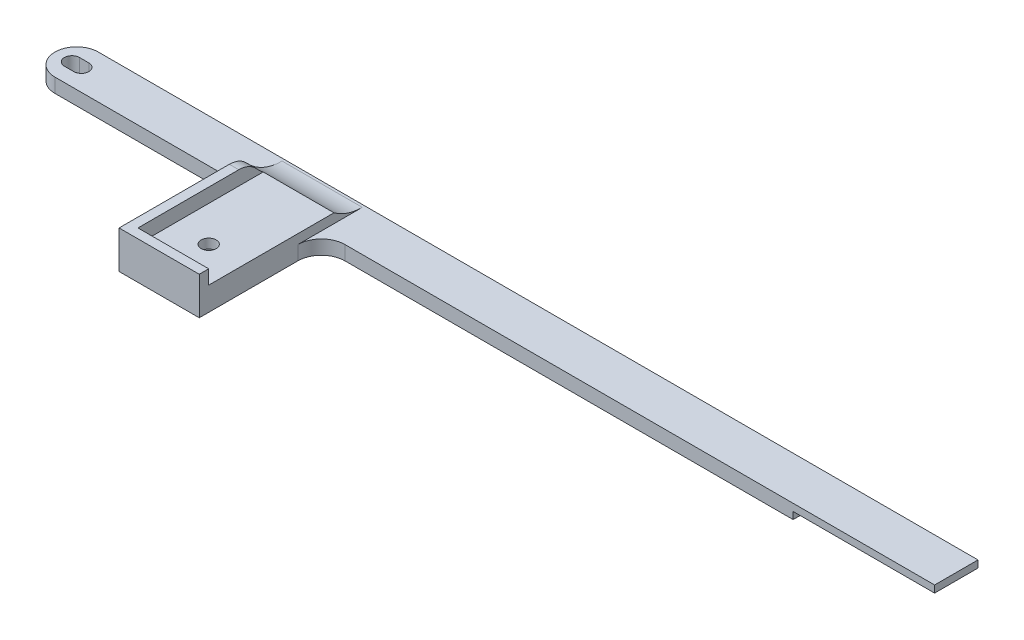
ISO-10303-21;
HEADER;
FILE_DESCRIPTION(('STEP AP214'),'2;1');
FILE_NAME('part.step','',(''),(''),'','','');
FILE_SCHEMA(('AUTOMOTIVE_DESIGN { 1 0 10303 214 1 1 1 1 }'));
ENDSEC;
DATA;
#1=APPLICATION_CONTEXT('core data for automotive mechanical design processes');
#2=APPLICATION_PROTOCOL_DEFINITION('international standard','automotive_design',2000,#1);
#3=PRODUCT_CONTEXT('',#1,'mechanical');
#4=PRODUCT('Part','Part','',(#3));
#5=PRODUCT_RELATED_PRODUCT_CATEGORY('part','',(#4));
#6=PRODUCT_DEFINITION_FORMATION('','',#4);
#7=PRODUCT_DEFINITION_CONTEXT('part definition',#1,'design');
#8=PRODUCT_DEFINITION('design','',#6,#7);
#9=PRODUCT_DEFINITION_SHAPE('','',#8);
#10=(LENGTH_UNIT() NAMED_UNIT(*) SI_UNIT(.MILLI.,.METRE.));
#11=(NAMED_UNIT(*) PLANE_ANGLE_UNIT() SI_UNIT($,.RADIAN.));
#12=(NAMED_UNIT(*) SI_UNIT($,.STERADIAN.) SOLID_ANGLE_UNIT());
#13=UNCERTAINTY_MEASURE_WITH_UNIT(LENGTH_MEASURE(1.E-05),#10,'distance_accuracy_value','');
#14=(GEOMETRIC_REPRESENTATION_CONTEXT(3) GLOBAL_UNCERTAINTY_ASSIGNED_CONTEXT((#13)) GLOBAL_UNIT_ASSIGNED_CONTEXT((#10,
#11,#12)) REPRESENTATION_CONTEXT('',''));
#15=CARTESIAN_POINT('',(0.,0.,0.));
#16=DIRECTION('',(0.,0.,1.));
#17=DIRECTION('',(1.,0.,0.));
#18=AXIS2_PLACEMENT_3D('',#15,#16,#17);
#19=CARTESIAN_POINT('',(30.,1.5,4.6));
#20=DIRECTION('',(0.,1.,0.));
#21=DIRECTION('',(0.,0.,1.));
#22=AXIS2_PLACEMENT_3D('',#19,#20,#21);
#23=PLANE('',#22);
#24=DIRECTION('',(0.,0.,-1.));
#25=VECTOR('',#24,1.);
#26=CARTESIAN_POINT('',(0.,1.5,4.6));
#27=LINE('',#26,#25);
#28=CARTESIAN_POINT('',(0.,1.5,4.6));
#29=VERTEX_POINT('',#28);
#30=CARTESIAN_POINT('',(0.,1.5,-4.6));
#31=VERTEX_POINT('',#30);
#32=EDGE_CURVE('E265',#29,#31,#27,.T.);
#33=ORIENTED_EDGE('',*,*,#32,.T.);
#34=DIRECTION('',(-1.,0.,0.));
#35=VECTOR('',#34,1.);
#36=CARTESIAN_POINT('',(30.,1.5,-4.6));
#37=LINE('',#36,#35);
#38=CARTESIAN_POINT('',(30.,1.5,-4.6));
#39=VERTEX_POINT('',#38);
#40=EDGE_CURVE('E283',#39,#31,#37,.T.);
#41=ORIENTED_EDGE('',*,*,#40,.F.);
#42=DIRECTION('',(0.,0.,-1.));
#43=VECTOR('',#42,1.);
#44=CARTESIAN_POINT('',(30.,1.5,4.6));
#45=LINE('',#44,#43);
#46=CARTESIAN_POINT('',(30.,1.5,4.6));
#47=VERTEX_POINT('',#46);
#48=EDGE_CURVE('E276',#47,#39,#45,.T.);
#49=ORIENTED_EDGE('',*,*,#48,.F.);
#50=DIRECTION('',(-1.,0.,0.));
#51=VECTOR('',#50,1.);
#52=CARTESIAN_POINT('',(30.,1.5,4.6));
#53=LINE('',#52,#51);
#54=EDGE_CURVE('E287',#47,#29,#53,.T.);
#55=ORIENTED_EDGE('',*,*,#54,.T.);
#56=EDGE_LOOP('',(#33,#41,#49,#55));
#57=FACE_BOUND('',#56,.T.);
#58=DIRECTION('',(0.,0.,-1.));
#59=VECTOR('',#58,1.);
#60=CARTESIAN_POINT('',(10.1,1.5,2.4));
#61=LINE('',#60,#59);
#62=CARTESIAN_POINT('',(10.1,1.5,2.4));
#63=VERTEX_POINT('',#62);
#64=CARTESIAN_POINT('',(10.1,1.5,-2.4));
#65=VERTEX_POINT('',#64);
#66=EDGE_CURVE('E264',#63,#65,#61,.T.);
#67=ORIENTED_EDGE('',*,*,#66,.F.);
#68=DIRECTION('',(-1.,0.,0.));
#69=VECTOR('',#68,1.);
#70=CARTESIAN_POINT('',(19.9,1.5,2.4));
#71=LINE('',#70,#69);
#72=CARTESIAN_POINT('',(19.9,1.5,2.4));
#73=VERTEX_POINT('',#72);
#74=EDGE_CURVE('E261',#73,#63,#71,.T.);
#75=ORIENTED_EDGE('',*,*,#74,.F.);
#76=DIRECTION('',(0.,0.,1.));
#77=VECTOR('',#76,1.);
#78=CARTESIAN_POINT('',(19.9,1.5,2.4));
#79=LINE('',#78,#77);
#80=CARTESIAN_POINT('',(19.9,1.5,-2.4));
#81=VERTEX_POINT('',#80);
#82=EDGE_CURVE('E55',#81,#73,#79,.T.);
#83=ORIENTED_EDGE('',*,*,#82,.F.);
#84=DIRECTION('',(1.,0.,0.));
#85=VECTOR('',#84,1.);
#86=CARTESIAN_POINT('',(19.9,1.5,-2.4));
#87=LINE('',#86,#85);
#88=EDGE_CURVE('E50',#65,#81,#87,.T.);
#89=ORIENTED_EDGE('',*,*,#88,.F.);
#90=EDGE_LOOP('',(#67,#75,#83,#89));
#91=FACE_BOUND('',#90,.T.);
#92=ADVANCED_FACE('F33',(#57,#91),#23,.F.);
#93=CARTESIAN_POINT('',(0.,0.,0.));
#94=DIRECTION('',(1.,0.,0.));
#95=DIRECTION('',(0.,0.,-1.));
#96=AXIS2_PLACEMENT_3D('',#93,#94,#95);
#97=PLANE('',#96);
#98=ORIENTED_EDGE('',*,*,#32,.F.);
#99=DIRECTION('',(0.,-1.,0.));
#100=VECTOR('',#99,1.);
#101=CARTESIAN_POINT('',(0.,3.,4.6));
#102=LINE('',#101,#100);
#103=CARTESIAN_POINT('',(0.,0.,4.6));
#104=VERTEX_POINT('',#103);
#105=EDGE_CURVE('E294',#29,#104,#102,.T.);
#106=ORIENTED_EDGE('',*,*,#105,.T.);
#107=DIRECTION('',(0.,0.,-1.));
#108=VECTOR('',#107,1.);
#109=CARTESIAN_POINT('',(0.,0.,0.));
#110=LINE('',#109,#108);
#111=CARTESIAN_POINT('',(0.,0.,-4.6));
#112=VERTEX_POINT('',#111);
#113=EDGE_CURVE('E476',#104,#112,#110,.T.);
#114=ORIENTED_EDGE('',*,*,#113,.T.);
#115=DIRECTION('',(0.,1.,0.));
#116=VECTOR('',#115,1.);
#117=CARTESIAN_POINT('',(0.,3.,-4.6));
#118=LINE('',#117,#116);
#119=EDGE_CURVE('E290',#112,#31,#118,.T.);
#120=ORIENTED_EDGE('',*,*,#119,.T.);
#121=EDGE_LOOP('',(#98,#106,#114,#120));
#122=FACE_BOUND('',#121,.T.);
#123=ADVANCED_FACE('F502',(#122),#97,.T.);
#124=CARTESIAN_POINT('',(156.5,3.,4.6));
#125=DIRECTION('',(0.,0.,-1.));
#126=DIRECTION('',(-1.,0.,0.));
#127=AXIS2_PLACEMENT_3D('',#124,#125,#126);
#128=PLANE('',#127);
#129=ORIENTED_EDGE('',*,*,#105,.F.);
#130=ORIENTED_EDGE('',*,*,#54,.F.);
#131=DIRECTION('',(0.,-1.,0.));
#132=VECTOR('',#131,1.);
#133=CARTESIAN_POINT('',(30.,3.,4.6));
#134=LINE('',#133,#132);
#135=CARTESIAN_POINT('',(30.,3.,4.6));
#136=VERTEX_POINT('',#135);
#137=EDGE_CURVE('E268',#136,#47,#134,.T.);
#138=ORIENTED_EDGE('',*,*,#137,.F.);
#139=DIRECTION('',(1.,0.,0.));
#140=VECTOR('',#139,1.);
#141=CARTESIAN_POINT('',(156.5,3.,4.6));
#142=LINE('',#141,#140);
#143=CARTESIAN_POINT('',(-94.9999999999999,3.,4.6));
#144=VERTEX_POINT('',#143);
#145=EDGE_CURVE('E356',#144,#136,#142,.T.);
#146=ORIENTED_EDGE('',*,*,#145,.F.);
#147=DIRECTION('',(0.,-1.,0.));
#148=VECTOR('',#147,1.);
#149=CARTESIAN_POINT('',(-94.9999999999999,0.,4.6));
#150=LINE('',#149,#148);
#151=CARTESIAN_POINT('',(-94.9999999999999,0.,4.6));
#152=VERTEX_POINT('',#151);
#153=EDGE_CURVE('E318',#144,#152,#150,.T.);
#154=ORIENTED_EDGE('',*,*,#153,.T.);
#155=DIRECTION('',(1.,0.,0.));
#156=VECTOR('',#155,1.);
#157=CARTESIAN_POINT('',(156.5,0.,4.6));
#158=LINE('',#157,#156);
#159=EDGE_CURVE('E351',#152,#104,#158,.T.);
#160=ORIENTED_EDGE('',*,*,#159,.T.);
#161=EDGE_LOOP('',(#129,#130,#138,#146,#154,#160));
#162=FACE_BOUND('',#161,.T.);
#163=ADVANCED_FACE('F494',(#162),#128,.F.);
#164=CARTESIAN_POINT('',(-156.5,3.,0.));
#165=DIRECTION('',(0.,1.,0.));
#166=DIRECTION('',(0.,0.,1.));
#167=AXIS2_PLACEMENT_3D('',#164,#165,#166);
#168=PLANE('',#167);
#169=DIRECTION('',(-1.,0.,0.));
#170=VECTOR('',#169,1.);
#171=CARTESIAN_POINT('',(-155.5,3.,-1.59999999999996));
#172=LINE('',#171,#170);
#173=CARTESIAN_POINT('',(-155.5,3.,-1.59999999999996));
#174=VERTEX_POINT('',#173);
#175=CARTESIAN_POINT('',(-157.5,3.,-1.59999999999996));
#176=VERTEX_POINT('',#175);
#177=EDGE_CURVE('E385',#174,#176,#172,.T.);
#178=ORIENTED_EDGE('',*,*,#177,.F.);
#179=CARTESIAN_POINT('',(-155.5,3.,0.));
#180=DIRECTION('',(0.,1.,0.));
#181=DIRECTION('',(0.,0.,1.));
#182=AXIS2_PLACEMENT_3D('',#179,#180,#181);
#183=CIRCLE('',#182,1.59999999999996);
#184=CARTESIAN_POINT('',(-155.5,3.,1.59999999999996));
#185=VERTEX_POINT('',#184);
#186=EDGE_CURVE('E371',#185,#174,#183,.T.);
#187=ORIENTED_EDGE('',*,*,#186,.F.);
#188=DIRECTION('',(1.,0.,0.));
#189=VECTOR('',#188,1.);
#190=CARTESIAN_POINT('',(-155.5,3.,1.59999999999996));
#191=LINE('',#190,#189);
#192=CARTESIAN_POINT('',(-157.5,3.,1.60000000000004));
#193=VERTEX_POINT('',#192);
#194=EDGE_CURVE('E366',#193,#185,#191,.T.);
#195=ORIENTED_EDGE('',*,*,#194,.F.);
#196=CARTESIAN_POINT('',(-157.5,3.,0.));
#197=DIRECTION('',(0.,1.,0.));
#198=DIRECTION('',(0.,0.,1.));
#199=AXIS2_PLACEMENT_3D('',#196,#197,#198);
#200=CIRCLE('',#199,1.6);
#201=EDGE_CURVE('E382',#176,#193,#200,.T.);
#202=ORIENTED_EDGE('',*,*,#201,.F.);
#203=EDGE_LOOP('',(#178,#187,#195,#202));
#204=FACE_BOUND('',#203,.T.);
#205=ORIENTED_EDGE('',*,*,#145,.T.);
#206=DIRECTION('',(0.,0.,1.));
#207=VECTOR('',#206,1.);
#208=CARTESIAN_POINT('',(30.,3.,4.6));
#209=LINE('',#208,#207);
#210=CARTESIAN_POINT('',(30.,3.,-4.6));
#211=VERTEX_POINT('',#210);
#212=EDGE_CURVE('E281',#211,#136,#209,.T.);
#213=ORIENTED_EDGE('',*,*,#212,.F.);
#214=DIRECTION('',(-1.,0.,0.));
#215=VECTOR('',#214,1.);
#216=CARTESIAN_POINT('',(-156.5,3.,-4.6));
#217=LINE('',#216,#215);
#218=CARTESIAN_POINT('',(-156.5,3.,-4.6));
#219=VERTEX_POINT('',#218);
#220=EDGE_CURVE('E346',#211,#219,#217,.T.);
#221=ORIENTED_EDGE('',*,*,#220,.T.);
#222=CARTESIAN_POINT('',(-156.5,3.,0.));
#223=DIRECTION('',(0.,1.,0.));
#224=DIRECTION('',(0.,0.,1.));
#225=AXIS2_PLACEMENT_3D('',#222,#223,#224);
#226=CIRCLE('',#225,4.6);
#227=CARTESIAN_POINT('',(-156.5,3.,4.6));
#228=VERTEX_POINT('',#227);
#229=EDGE_CURVE('E352',#219,#228,#226,.T.);
#230=ORIENTED_EDGE('',*,*,#229,.T.);
#231=CARTESIAN_POINT('',(-122.,3.,4.6));
#232=VERTEX_POINT('',#231);
#233=EDGE_CURVE('E481',#228,#232,#142,.T.);
#234=ORIENTED_EDGE('',*,*,#233,.T.);
#235=CARTESIAN_POINT('',(-122.,3.,9.6));
#236=DIRECTION('',(0.,1.,0.));
#237=DIRECTION('',(0.,0.,1.));
#238=AXIS2_PLACEMENT_3D('',#235,#236,#237);
#239=CIRCLE('',#238,5.);
#240=CARTESIAN_POINT('',(-117.,3.,9.6));
#241=VERTEX_POINT('',#240);
#242=EDGE_CURVE('E301',#232,#241,#239,.F.);
#243=ORIENTED_EDGE('',*,*,#242,.T.);
#244=DIRECTION('',(0.,0.,-1.));
#245=VECTOR('',#244,1.);
#246=CARTESIAN_POINT('',(-117.,3.,0.));
#247=LINE('',#246,#245);
#248=CARTESIAN_POINT('',(-117.,3.,-4.06025403784438));
#249=VERTEX_POINT('',#248);
#250=EDGE_CURVE('E337',#241,#249,#247,.T.);
#251=ORIENTED_EDGE('',*,*,#250,.T.);
#252=DIRECTION('',(-1.,0.,0.));
#253=VECTOR('',#252,1.);
#254=CARTESIAN_POINT('',(-99.9999999999999,3.,-4.06025403784438));
#255=LINE('',#254,#253);
#256=CARTESIAN_POINT('',(-100.,3.,-4.06025403784438));
#257=VERTEX_POINT('',#256);
#258=EDGE_CURVE('E334',#249,#257,#255,.F.);
#259=ORIENTED_EDGE('',*,*,#258,.T.);
#260=DIRECTION('',(0.,0.,1.));
#261=VECTOR('',#260,1.);
#262=CARTESIAN_POINT('',(-100.,3.,0.));
#263=LINE('',#262,#261);
#264=CARTESIAN_POINT('',(-100.,3.,9.6));
#265=VERTEX_POINT('',#264);
#266=EDGE_CURVE('E332',#257,#265,#263,.T.);
#267=ORIENTED_EDGE('',*,*,#266,.T.);
#268=CARTESIAN_POINT('',(-94.9999999999999,3.,9.6));
#269=DIRECTION('',(0.,1.,0.));
#270=DIRECTION('',(0.,0.,1.));
#271=AXIS2_PLACEMENT_3D('',#268,#269,#270);
#272=CIRCLE('',#271,5.);
#273=EDGE_CURVE('E306',#265,#144,#272,.F.);
#274=ORIENTED_EDGE('',*,*,#273,.T.);
#275=EDGE_LOOP('',(#205,#213,#221,#230,#234,#243,#251,#259,#267,#274));
#276=FACE_BOUND('',#275,.T.);
#277=ADVANCED_FACE('F511',(#204,#276),#168,.T.);
#278=CARTESIAN_POINT('',(-156.5,0.,0.));
#279=DIRECTION('',(0.,1.,0.));
#280=DIRECTION('',(0.,0.,1.));
#281=AXIS2_PLACEMENT_3D('',#278,#279,#280);
#282=PLANE('',#281);
#283=CARTESIAN_POINT('',(-155.5,0.,0.));
#284=DIRECTION('',(0.,1.,0.));
#285=DIRECTION('',(0.,0.,1.));
#286=AXIS2_PLACEMENT_3D('',#283,#284,#285);
#287=CIRCLE('',#286,1.59999999999996);
#288=CARTESIAN_POINT('',(-155.5,0.,1.59999999999996));
#289=VERTEX_POINT('',#288);
#290=CARTESIAN_POINT('',(-155.5,0.,-1.59999999999996));
#291=VERTEX_POINT('',#290);
#292=EDGE_CURVE('E377',#289,#291,#287,.T.);
#293=ORIENTED_EDGE('',*,*,#292,.T.);
#294=DIRECTION('',(-1.,0.,0.));
#295=VECTOR('',#294,1.);
#296=CARTESIAN_POINT('',(-155.5,0.,-1.59999999999996));
#297=LINE('',#296,#295);
#298=CARTESIAN_POINT('',(-157.5,0.,-1.59999999999996));
#299=VERTEX_POINT('',#298);
#300=EDGE_CURVE('E374',#291,#299,#297,.T.);
#301=ORIENTED_EDGE('',*,*,#300,.T.);
#302=CARTESIAN_POINT('',(-157.5,0.,0.));
#303=DIRECTION('',(0.,1.,0.));
#304=DIRECTION('',(0.,0.,1.));
#305=AXIS2_PLACEMENT_3D('',#302,#303,#304);
#306=CIRCLE('',#305,1.6);
#307=CARTESIAN_POINT('',(-157.5,0.,1.60000000000004));
#308=VERTEX_POINT('',#307);
#309=EDGE_CURVE('E370',#299,#308,#306,.T.);
#310=ORIENTED_EDGE('',*,*,#309,.T.);
#311=DIRECTION('',(1.,0.,0.));
#312=VECTOR('',#311,1.);
#313=CARTESIAN_POINT('',(-155.5,0.,1.59999999999996));
#314=LINE('',#313,#312);
#315=EDGE_CURVE('E367',#308,#289,#314,.T.);
#316=ORIENTED_EDGE('',*,*,#315,.T.);
#317=EDGE_LOOP('',(#293,#301,#310,#316));
#318=FACE_BOUND('',#317,.T.);
#319=DIRECTION('',(-0.866025403784438,0.,-0.500000000000001));
#320=VECTOR('',#319,1.);
#321=CARTESIAN_POINT('',(-107.5,0.,24.2331615074619));
#322=LINE('',#321,#320);
#323=CARTESIAN_POINT('',(-107.5,0.,24.2331615074619));
#324=VERTEX_POINT('',#323);
#325=CARTESIAN_POINT('',(-110.3,0.,22.616580753731));
#326=VERTEX_POINT('',#325);
#327=EDGE_CURVE('E452',#324,#326,#322,.T.);
#328=ORIENTED_EDGE('',*,*,#327,.F.);
#329=DIRECTION('',(-0.866025403784439,0.,0.499999999999999));
#330=VECTOR('',#329,1.);
#331=CARTESIAN_POINT('',(-104.7,0.,22.6165807537309));
#332=LINE('',#331,#330);
#333=CARTESIAN_POINT('',(-104.7,0.,22.6165807537309));
#334=VERTEX_POINT('',#333);
#335=EDGE_CURVE('E455',#334,#324,#332,.T.);
#336=ORIENTED_EDGE('',*,*,#335,.F.);
#337=DIRECTION('',(0.,0.,1.));
#338=VECTOR('',#337,1.);
#339=CARTESIAN_POINT('',(-104.7,0.,19.383419246269));
#340=LINE('',#339,#338);
#341=CARTESIAN_POINT('',(-104.7,0.,19.383419246269));
#342=VERTEX_POINT('',#341);
#343=EDGE_CURVE('E439',#342,#334,#340,.T.);
#344=ORIENTED_EDGE('',*,*,#343,.F.);
#345=DIRECTION('',(0.866025403784438,0.,0.500000000000001));
#346=VECTOR('',#345,1.);
#347=CARTESIAN_POINT('',(-107.5,0.,17.7668384925381));
#348=LINE('',#347,#346);
#349=CARTESIAN_POINT('',(-107.5,0.,17.7668384925381));
#350=VERTEX_POINT('',#349);
#351=EDGE_CURVE('E442',#350,#342,#348,.T.);
#352=ORIENTED_EDGE('',*,*,#351,.F.);
#353=DIRECTION('',(0.866025403784439,0.,-0.5));
#354=VECTOR('',#353,1.);
#355=CARTESIAN_POINT('',(-110.3,0.,19.383419246269));
#356=LINE('',#355,#354);
#357=CARTESIAN_POINT('',(-110.3,0.,19.383419246269));
#358=VERTEX_POINT('',#357);
#359=EDGE_CURVE('E446',#358,#350,#356,.T.);
#360=ORIENTED_EDGE('',*,*,#359,.F.);
#361=DIRECTION('',(0.,0.,-1.));
#362=VECTOR('',#361,1.);
#363=CARTESIAN_POINT('',(-110.3,0.,22.616580753731));
#364=LINE('',#363,#362);
#365=EDGE_CURVE('E449',#326,#358,#364,.T.);
#366=ORIENTED_EDGE('',*,*,#365,.F.);
#367=EDGE_LOOP('',(#328,#336,#344,#352,#360,#366));
#368=FACE_BOUND('',#367,.T.);
#369=ORIENTED_EDGE('',*,*,#113,.F.);
#370=ORIENTED_EDGE('',*,*,#159,.F.);
#371=CARTESIAN_POINT('',(-94.9999999999999,0.,9.6));
#372=DIRECTION('',(0.,1.,0.));
#373=DIRECTION('',(0.,0.,1.));
#374=AXIS2_PLACEMENT_3D('',#371,#372,#373);
#375=CIRCLE('',#374,5.);
#376=CARTESIAN_POINT('',(-100.,0.,9.6));
#377=VERTEX_POINT('',#376);
#378=EDGE_CURVE('E308',#152,#377,#375,.T.);
#379=ORIENTED_EDGE('',*,*,#378,.T.);
#380=DIRECTION('',(0.,0.,1.));
#381=VECTOR('',#380,1.);
#382=CARTESIAN_POINT('',(-100.,0.,4.6));
#383=LINE('',#382,#381);
#384=CARTESIAN_POINT('',(-100.,0.,30.5));
#385=VERTEX_POINT('',#384);
#386=EDGE_CURVE('E397',#377,#385,#383,.T.);
#387=ORIENTED_EDGE('',*,*,#386,.T.);
#388=DIRECTION('',(-1.,0.,0.));
#389=VECTOR('',#388,1.);
#390=CARTESIAN_POINT('',(-117.,0.,30.5));
#391=LINE('',#390,#389);
#392=CARTESIAN_POINT('',(-117.,0.,30.5));
#393=VERTEX_POINT('',#392);
#394=EDGE_CURVE('E399',#385,#393,#391,.T.);
#395=ORIENTED_EDGE('',*,*,#394,.T.);
#396=DIRECTION('',(0.,0.,-1.));
#397=VECTOR('',#396,1.);
#398=CARTESIAN_POINT('',(-117.,0.,13.5));
#399=LINE('',#398,#397);
#400=CARTESIAN_POINT('',(-117.,0.,9.6));
#401=VERTEX_POINT('',#400);
#402=EDGE_CURVE('E394',#393,#401,#399,.T.);
#403=ORIENTED_EDGE('',*,*,#402,.T.);
#404=CARTESIAN_POINT('',(-122.,0.,9.6));
#405=DIRECTION('',(0.,1.,0.));
#406=DIRECTION('',(0.,0.,1.));
#407=AXIS2_PLACEMENT_3D('',#404,#405,#406);
#408=CIRCLE('',#407,5.);
#409=CARTESIAN_POINT('',(-122.,0.,4.6));
#410=VERTEX_POINT('',#409);
#411=EDGE_CURVE('E304',#401,#410,#408,.T.);
#412=ORIENTED_EDGE('',*,*,#411,.T.);
#413=CARTESIAN_POINT('',(-156.5,0.,4.6));
#414=VERTEX_POINT('',#413);
#415=EDGE_CURVE('E37',#414,#410,#158,.T.);
#416=ORIENTED_EDGE('',*,*,#415,.F.);
#417=CARTESIAN_POINT('',(-156.5,0.,0.));
#418=DIRECTION('',(0.,1.,0.));
#419=DIRECTION('',(0.,0.,1.));
#420=AXIS2_PLACEMENT_3D('',#417,#418,#419);
#421=CIRCLE('',#420,4.6);
#422=CARTESIAN_POINT('',(-156.5,0.,-4.6));
#423=VERTEX_POINT('',#422);
#424=EDGE_CURVE('E347',#423,#414,#421,.T.);
#425=ORIENTED_EDGE('',*,*,#424,.F.);
#426=DIRECTION('',(-1.,0.,0.));
#427=VECTOR('',#426,1.);
#428=CARTESIAN_POINT('',(-156.5,0.,-4.6));
#429=LINE('',#428,#427);
#430=EDGE_CURVE('E355',#112,#423,#429,.T.);
#431=ORIENTED_EDGE('',*,*,#430,.F.);
#432=EDGE_LOOP('',(#369,#370,#379,#387,#395,#403,#412,#416,#425,#431));
#433=FACE_BOUND('',#432,.T.);
#434=ADVANCED_FACE('F499',(#318,#368,#433),#282,.F.);
#435=CARTESIAN_POINT('',(-156.5,3.,-4.6));
#436=DIRECTION('',(0.,0.,1.));
#437=DIRECTION('',(1.,0.,0.));
#438=AXIS2_PLACEMENT_3D('',#435,#436,#437);
#439=PLANE('',#438);
#440=ORIENTED_EDGE('',*,*,#119,.F.);
#441=ORIENTED_EDGE('',*,*,#430,.T.);
#442=DIRECTION('',(0.,-1.,0.));
#443=VECTOR('',#442,1.);
#444=CARTESIAN_POINT('',(-156.5,3.,-4.6));
#445=LINE('',#444,#443);
#446=EDGE_CURVE('E343',#219,#423,#445,.T.);
#447=ORIENTED_EDGE('',*,*,#446,.F.);
#448=ORIENTED_EDGE('',*,*,#220,.F.);
#449=DIRECTION('',(0.,1.,0.));
#450=VECTOR('',#449,1.);
#451=CARTESIAN_POINT('',(30.,3.,-4.6));
#452=LINE('',#451,#450);
#453=EDGE_CURVE('E278',#39,#211,#452,.T.);
#454=ORIENTED_EDGE('',*,*,#453,.F.);
#455=ORIENTED_EDGE('',*,*,#40,.T.);
#456=EDGE_LOOP('',(#440,#441,#447,#448,#454,#455));
#457=FACE_BOUND('',#456,.T.);
#458=ADVANCED_FACE('F35',(#457),#439,.F.);
#459=CARTESIAN_POINT('',(0.,5.,0.));
#460=DIRECTION('',(0.,-1.,0.));
#461=DIRECTION('',(0.,0.,-1.));
#462=AXIS2_PLACEMENT_3D('',#459,#460,#461);
#463=PLANE('',#462);
#464=CARTESIAN_POINT('',(-107.5,5.,21.));
#465=DIRECTION('',(0.,-1.,0.));
#466=DIRECTION('',(0.,0.,-1.));
#467=AXIS2_PLACEMENT_3D('',#464,#465,#466);
#468=CIRCLE('',#467,1.6);
#469=CARTESIAN_POINT('',(-107.5,5.,19.4));
#470=VERTEX_POINT('',#469);
#471=EDGE_CURVE('E42',#470,#470,#468,.F.);
#472=ORIENTED_EDGE('',*,*,#471,.F.);
#473=EDGE_LOOP('',(#472));
#474=FACE_BOUND('',#473,.T.);
#475=DIRECTION('',(0.,0.,-1.));
#476=VECTOR('',#475,1.);
#477=CARTESIAN_POINT('',(-115.,5.,4.6));
#478=LINE('',#477,#476);
#479=CARTESIAN_POINT('',(-115.,5.,28.5));
#480=VERTEX_POINT('',#479);
#481=CARTESIAN_POINT('',(-115.,5.,1.93974596215562));
#482=VERTEX_POINT('',#481);
#483=EDGE_CURVE('E409',#480,#482,#478,.T.);
#484=ORIENTED_EDGE('',*,*,#483,.F.);
#485=DIRECTION('',(-1.,0.,0.));
#486=VECTOR('',#485,1.);
#487=CARTESIAN_POINT('',(-115.,5.,28.5));
#488=LINE('',#487,#486);
#489=CARTESIAN_POINT('',(-100.,5.,28.5));
#490=VERTEX_POINT('',#489);
#491=EDGE_CURVE('E411',#490,#480,#488,.T.);
#492=ORIENTED_EDGE('',*,*,#491,.F.);
#493=DIRECTION('',(0.,0.,-1.));
#494=VECTOR('',#493,1.);
#495=CARTESIAN_POINT('',(-100.,5.,4.6));
#496=LINE('',#495,#494);
#497=CARTESIAN_POINT('',(-100.,5.,1.93974596215562));
#498=VERTEX_POINT('',#497);
#499=EDGE_CURVE('E392',#490,#498,#496,.T.);
#500=ORIENTED_EDGE('',*,*,#499,.T.);
#501=DIRECTION('',(1.,0.,0.));
#502=VECTOR('',#501,1.);
#503=CARTESIAN_POINT('',(-100.,5.,1.93974596215561));
#504=LINE('',#503,#502);
#505=EDGE_CURVE('E326',#498,#482,#504,.F.);
#506=ORIENTED_EDGE('',*,*,#505,.T.);
#507=EDGE_LOOP('',(#484,#492,#500,#506));
#508=FACE_BOUND('',#507,.T.);
#509=ADVANCED_FACE('F562',(#474,#508),#463,.F.);
#510=ORIENTED_EDGE('',*,*,#415,.T.);
#511=DIRECTION('',(0.,-1.,0.));
#512=VECTOR('',#511,1.);
#513=CARTESIAN_POINT('',(-122.,3.,4.6));
#514=LINE('',#513,#512);
#515=EDGE_CURVE('E310',#410,#232,#514,.F.);
#516=ORIENTED_EDGE('',*,*,#515,.T.);
#517=ORIENTED_EDGE('',*,*,#233,.F.);
#518=DIRECTION('',(0.,-1.,0.));
#519=VECTOR('',#518,1.);
#520=CARTESIAN_POINT('',(-156.5,3.,4.6));
#521=LINE('',#520,#519);
#522=EDGE_CURVE('E340',#228,#414,#521,.T.);
#523=ORIENTED_EDGE('',*,*,#522,.T.);
#524=EDGE_LOOP('',(#510,#516,#517,#523));
#525=FACE_BOUND('',#524,.T.);
#526=ADVANCED_FACE('F536',(#525),#128,.F.);
#527=CARTESIAN_POINT('',(-156.5,3.,0.));
#528=DIRECTION('',(0.,-1.,0.));
#529=DIRECTION('',(0.,0.,-1.));
#530=AXIS2_PLACEMENT_3D('',#527,#528,#529);
#531=CYLINDRICAL_SURFACE('',#530,4.6);
#532=ORIENTED_EDGE('',*,*,#424,.T.);
#533=ORIENTED_EDGE('',*,*,#522,.F.);
#534=ORIENTED_EDGE('',*,*,#229,.F.);
#535=ORIENTED_EDGE('',*,*,#446,.T.);
#536=EDGE_LOOP('',(#532,#533,#534,#535));
#537=FACE_BOUND('',#536,.T.);
#538=ADVANCED_FACE('F539',(#537),#531,.T.);
#539=CARTESIAN_POINT('',(-155.5,3.,0.));
#540=DIRECTION('',(0.,-1.,0.));
#541=DIRECTION('',(0.,0.,-1.));
#542=AXIS2_PLACEMENT_3D('',#539,#540,#541);
#543=CYLINDRICAL_SURFACE('',#542,1.59999999999996);
#544=ORIENTED_EDGE('',*,*,#292,.F.);
#545=DIRECTION('',(0.,-1.,0.));
#546=VECTOR('',#545,1.);
#547=CARTESIAN_POINT('',(-155.5,3.,1.59999999999996));
#548=LINE('',#547,#546);
#549=EDGE_CURVE('E363',#185,#289,#548,.T.);
#550=ORIENTED_EDGE('',*,*,#549,.F.);
#551=ORIENTED_EDGE('',*,*,#186,.T.);
#552=DIRECTION('',(0.,-1.,0.));
#553=VECTOR('',#552,1.);
#554=CARTESIAN_POINT('',(-155.5,3.,-1.59999999999996));
#555=LINE('',#554,#553);
#556=EDGE_CURVE('E350',#174,#291,#555,.T.);
#557=ORIENTED_EDGE('',*,*,#556,.T.);
#558=EDGE_LOOP('',(#544,#550,#551,#557));
#559=FACE_BOUND('',#558,.T.);
#560=ADVANCED_FACE('F667',(#559),#543,.F.);
#561=CARTESIAN_POINT('',(-155.5,3.,-1.59999999999996));
#562=DIRECTION('',(0.,0.,1.));
#563=DIRECTION('',(1.,0.,0.));
#564=AXIS2_PLACEMENT_3D('',#561,#562,#563);
#565=PLANE('',#564);
#566=ORIENTED_EDGE('',*,*,#300,.F.);
#567=ORIENTED_EDGE('',*,*,#556,.F.);
#568=ORIENTED_EDGE('',*,*,#177,.T.);
#569=DIRECTION('',(0.,-1.,0.));
#570=VECTOR('',#569,1.);
#571=CARTESIAN_POINT('',(-157.5,3.,-1.59999999999996));
#572=LINE('',#571,#570);
#573=EDGE_CURVE('E359',#176,#299,#572,.T.);
#574=ORIENTED_EDGE('',*,*,#573,.T.);
#575=EDGE_LOOP('',(#566,#567,#568,#574));
#576=FACE_BOUND('',#575,.T.);
#577=ADVANCED_FACE('F663',(#576),#565,.T.);
#578=CARTESIAN_POINT('',(-157.5,3.,0.));
#579=DIRECTION('',(0.,-1.,0.));
#580=DIRECTION('',(0.,0.,-1.));
#581=AXIS2_PLACEMENT_3D('',#578,#579,#580);
#582=CYLINDRICAL_SURFACE('',#581,1.6);
#583=ORIENTED_EDGE('',*,*,#309,.F.);
#584=ORIENTED_EDGE('',*,*,#573,.F.);
#585=ORIENTED_EDGE('',*,*,#201,.T.);
#586=DIRECTION('',(0.,-1.,0.));
#587=VECTOR('',#586,1.);
#588=CARTESIAN_POINT('',(-157.5,3.,1.60000000000004));
#589=LINE('',#588,#587);
#590=EDGE_CURVE('E361',#193,#308,#589,.T.);
#591=ORIENTED_EDGE('',*,*,#590,.T.);
#592=EDGE_LOOP('',(#583,#584,#585,#591));
#593=FACE_BOUND('',#592,.T.);
#594=ADVANCED_FACE('F659',(#593),#582,.F.);
#595=CARTESIAN_POINT('',(-155.5,3.,1.59999999999996));
#596=DIRECTION('',(0.,0.,-1.));
#597=DIRECTION('',(-1.,0.,0.));
#598=AXIS2_PLACEMENT_3D('',#595,#596,#597);
#599=PLANE('',#598);
#600=ORIENTED_EDGE('',*,*,#315,.F.);
#601=ORIENTED_EDGE('',*,*,#590,.F.);
#602=ORIENTED_EDGE('',*,*,#194,.T.);
#603=ORIENTED_EDGE('',*,*,#549,.T.);
#604=EDGE_LOOP('',(#600,#601,#602,#603));
#605=FACE_BOUND('',#604,.T.);
#606=ADVANCED_FACE('F656',(#605),#599,.T.);
#607=CARTESIAN_POINT('',(-117.,5.,13.5));
#608=DIRECTION('',(1.,0.,0.));
#609=DIRECTION('',(0.,0.,-1.));
#610=AXIS2_PLACEMENT_3D('',#607,#608,#609);
#611=PLANE('',#610);
#612=DIRECTION('',(0.,0.,1.));
#613=VECTOR('',#612,1.);
#614=CARTESIAN_POINT('',(-117.,8.,4.6));
#615=LINE('',#614,#613);
#616=CARTESIAN_POINT('',(-117.,8.,7.12008584965456));
#617=VERTEX_POINT('',#616);
#618=CARTESIAN_POINT('',(-117.,8.,30.5));
#619=VERTEX_POINT('',#618);
#620=EDGE_CURVE('E412',#617,#619,#615,.T.);
#621=ORIENTED_EDGE('',*,*,#620,.F.);
#622=CARTESIAN_POINT('',(-117.,3.,7.12008584965456));
#623=DIRECTION('',(1.,0.,0.));
#624=DIRECTION('',(0.,0.,-1.));
#625=AXIS2_PLACEMENT_3D('',#622,#623,#624);
#626=CIRCLE('',#625,5.);
#627=CARTESIAN_POINT('',(-117.,6.33333333333333,3.39330588715491));
#628=VERTEX_POINT('',#627);
#629=EDGE_CURVE('E296',#617,#628,#626,.F.);
#630=ORIENTED_EDGE('',*,*,#629,.T.);
#631=CARTESIAN_POINT('',(-117.,13.,-4.06025403784438));
#632=DIRECTION('',(1.,0.,0.));
#633=DIRECTION('',(0.,0.,-1.));
#634=AXIS2_PLACEMENT_3D('',#631,#632,#633);
#635=CIRCLE('',#634,10.);
#636=EDGE_CURVE('E321',#628,#249,#635,.T.);
#637=ORIENTED_EDGE('',*,*,#636,.T.);
#638=ORIENTED_EDGE('',*,*,#250,.F.);
#639=DIRECTION('',(0.,-1.,0.));
#640=VECTOR('',#639,1.);
#641=CARTESIAN_POINT('',(-117.,0.,9.6));
#642=LINE('',#641,#640);
#643=EDGE_CURVE('E312',#241,#401,#642,.T.);
#644=ORIENTED_EDGE('',*,*,#643,.T.);
#645=ORIENTED_EDGE('',*,*,#402,.F.);
#646=DIRECTION('',(0.,-1.,0.));
#647=VECTOR('',#646,1.);
#648=CARTESIAN_POINT('',(-117.,5.,30.5));
#649=LINE('',#648,#647);
#650=EDGE_CURVE('E380',#619,#393,#649,.T.);
#651=ORIENTED_EDGE('',*,*,#650,.F.);
#652=EDGE_LOOP('',(#621,#630,#637,#638,#644,#645,#651));
#653=FACE_BOUND('',#652,.T.);
#654=ADVANCED_FACE('F530',(#653),#611,.F.);
#655=CARTESIAN_POINT('',(-117.,5.,30.5));
#656=DIRECTION('',(0.,0.,-1.));
#657=DIRECTION('',(-1.,0.,0.));
#658=AXIS2_PLACEMENT_3D('',#655,#656,#657);
#659=PLANE('',#658);
#660=ORIENTED_EDGE('',*,*,#650,.T.);
#661=ORIENTED_EDGE('',*,*,#394,.F.);
#662=DIRECTION('',(0.,-1.,0.));
#663=VECTOR('',#662,1.);
#664=CARTESIAN_POINT('',(-100.,5.,30.5));
#665=LINE('',#664,#663);
#666=CARTESIAN_POINT('',(-100.,8.,30.5));
#667=VERTEX_POINT('',#666);
#668=EDGE_CURVE('E389',#667,#385,#665,.T.);
#669=ORIENTED_EDGE('',*,*,#668,.F.);
#670=DIRECTION('',(1.,0.,0.));
#671=VECTOR('',#670,1.);
#672=CARTESIAN_POINT('',(-117.,8.,30.5));
#673=LINE('',#672,#671);
#674=EDGE_CURVE('E422',#619,#667,#673,.T.);
#675=ORIENTED_EDGE('',*,*,#674,.F.);
#676=EDGE_LOOP('',(#660,#661,#669,#675));
#677=FACE_BOUND('',#676,.T.);
#678=ADVANCED_FACE('F525',(#677),#659,.F.);
#679=CARTESIAN_POINT('',(-100.,5.,4.6));
#680=DIRECTION('',(-1.,0.,0.));
#681=DIRECTION('',(0.,0.,1.));
#682=AXIS2_PLACEMENT_3D('',#679,#680,#681);
#683=PLANE('',#682);
#684=ORIENTED_EDGE('',*,*,#386,.F.);
#685=DIRECTION('',(0.,-1.,0.));
#686=VECTOR('',#685,1.);
#687=CARTESIAN_POINT('',(-100.,3.,9.6));
#688=LINE('',#687,#686);
#689=EDGE_CURVE('E315',#377,#265,#688,.F.);
#690=ORIENTED_EDGE('',*,*,#689,.T.);
#691=ORIENTED_EDGE('',*,*,#266,.F.);
#692=CARTESIAN_POINT('',(-100.,13.,-4.06025403784438));
#693=DIRECTION('',(-1.,0.,0.));
#694=DIRECTION('',(0.,0.,1.));
#695=AXIS2_PLACEMENT_3D('',#692,#693,#694);
#696=CIRCLE('',#695,10.);
#697=EDGE_CURVE('E329',#257,#498,#696,.T.);
#698=ORIENTED_EDGE('',*,*,#697,.T.);
#699=ORIENTED_EDGE('',*,*,#499,.F.);
#700=DIRECTION('',(0.,-1.,0.));
#701=VECTOR('',#700,1.);
#702=CARTESIAN_POINT('',(-100.,8.,28.5));
#703=LINE('',#702,#701);
#704=CARTESIAN_POINT('',(-100.,8.,28.5));
#705=VERTEX_POINT('',#704);
#706=EDGE_CURVE('E402',#705,#490,#703,.T.);
#707=ORIENTED_EDGE('',*,*,#706,.F.);
#708=DIRECTION('',(0.,0.,-1.));
#709=VECTOR('',#708,1.);
#710=CARTESIAN_POINT('',(-100.,8.,30.5));
#711=LINE('',#710,#709);
#712=EDGE_CURVE('E420',#667,#705,#711,.T.);
#713=ORIENTED_EDGE('',*,*,#712,.F.);
#714=ORIENTED_EDGE('',*,*,#668,.T.);
#715=EDGE_LOOP('',(#684,#690,#691,#698,#699,#707,#713,#714));
#716=FACE_BOUND('',#715,.T.);
#717=ADVANCED_FACE('F519',(#716),#683,.F.);
#718=CARTESIAN_POINT('',(-115.,8.,28.5));
#719=DIRECTION('',(0.,0.,1.));
#720=DIRECTION('',(1.,0.,0.));
#721=AXIS2_PLACEMENT_3D('',#718,#719,#720);
#722=PLANE('',#721);
#723=ORIENTED_EDGE('',*,*,#491,.T.);
#724=DIRECTION('',(0.,-1.,0.));
#725=VECTOR('',#724,1.);
#726=CARTESIAN_POINT('',(-115.,8.,28.5));
#727=LINE('',#726,#725);
#728=CARTESIAN_POINT('',(-115.,8.,28.5));
#729=VERTEX_POINT('',#728);
#730=EDGE_CURVE('E405',#729,#480,#727,.T.);
#731=ORIENTED_EDGE('',*,*,#730,.F.);
#732=DIRECTION('',(-1.,0.,0.));
#733=VECTOR('',#732,1.);
#734=CARTESIAN_POINT('',(-115.,8.,28.5));
#735=LINE('',#734,#733);
#736=EDGE_CURVE('E418',#705,#729,#735,.T.);
#737=ORIENTED_EDGE('',*,*,#736,.F.);
#738=ORIENTED_EDGE('',*,*,#706,.T.);
#739=EDGE_LOOP('',(#723,#731,#737,#738));
#740=FACE_BOUND('',#739,.T.);
#741=ADVANCED_FACE('F551',(#740),#722,.F.);
#742=CARTESIAN_POINT('',(-115.,8.,4.6));
#743=DIRECTION('',(-1.,0.,0.));
#744=DIRECTION('',(0.,0.,1.));
#745=AXIS2_PLACEMENT_3D('',#742,#743,#744);
#746=PLANE('',#745);
#747=CARTESIAN_POINT('',(-115.,13.,-4.06025403784438));
#748=DIRECTION('',(-1.,0.,0.));
#749=DIRECTION('',(0.,0.,1.));
#750=AXIS2_PLACEMENT_3D('',#747,#748,#749);
#751=CIRCLE('',#750,10.);
#752=CARTESIAN_POINT('',(-115.,6.33333333333333,3.39330588715491));
#753=VERTEX_POINT('',#752);
#754=EDGE_CURVE('E323',#482,#753,#751,.T.);
#755=ORIENTED_EDGE('',*,*,#754,.T.);
#756=CARTESIAN_POINT('',(-115.,3.,7.12008584965456));
#757=DIRECTION('',(-1.,0.,0.));
#758=DIRECTION('',(0.,0.,1.));
#759=AXIS2_PLACEMENT_3D('',#756,#757,#758);
#760=CIRCLE('',#759,5.);
#761=CARTESIAN_POINT('',(-115.,8.,7.12008584965456));
#762=VERTEX_POINT('',#761);
#763=EDGE_CURVE('E291',#753,#762,#760,.F.);
#764=ORIENTED_EDGE('',*,*,#763,.T.);
#765=DIRECTION('',(0.,0.,-1.));
#766=VECTOR('',#765,1.);
#767=CARTESIAN_POINT('',(-115.,8.,4.6));
#768=LINE('',#767,#766);
#769=EDGE_CURVE('E408',#729,#762,#768,.T.);
#770=ORIENTED_EDGE('',*,*,#769,.F.);
#771=ORIENTED_EDGE('',*,*,#730,.T.);
#772=ORIENTED_EDGE('',*,*,#483,.T.);
#773=EDGE_LOOP('',(#755,#764,#770,#771,#772));
#774=FACE_BOUND('',#773,.T.);
#775=ADVANCED_FACE('F561',(#774),#746,.F.);
#776=CARTESIAN_POINT('',(0.,8.,0.));
#777=DIRECTION('',(0.,-1.,0.));
#778=DIRECTION('',(0.,0.,-1.));
#779=AXIS2_PLACEMENT_3D('',#776,#777,#778);
#780=PLANE('',#779);
#781=ORIENTED_EDGE('',*,*,#769,.T.);
#782=DIRECTION('',(1.,0.,0.));
#783=VECTOR('',#782,1.);
#784=CARTESIAN_POINT('',(0.,8.,7.12008584965456));
#785=LINE('',#784,#783);
#786=EDGE_CURVE('E298',#762,#617,#785,.F.);
#787=ORIENTED_EDGE('',*,*,#786,.T.);
#788=ORIENTED_EDGE('',*,*,#620,.T.);
#789=ORIENTED_EDGE('',*,*,#674,.T.);
#790=ORIENTED_EDGE('',*,*,#712,.T.);
#791=ORIENTED_EDGE('',*,*,#736,.T.);
#792=EDGE_LOOP('',(#781,#787,#788,#789,#790,#791));
#793=FACE_BOUND('',#792,.T.);
#794=ADVANCED_FACE('F555',(#793),#780,.F.);
#795=CARTESIAN_POINT('',(-104.7,3.,22.6165807537309));
#796=DIRECTION('',(0.499999999999999,0.,0.866025403784439));
#797=DIRECTION('',(0.866025403784439,0.,-0.499999999999999));
#798=AXIS2_PLACEMENT_3D('',#795,#796,#797);
#799=PLANE('',#798);
#800=ORIENTED_EDGE('',*,*,#335,.T.);
#801=DIRECTION('',(0.,-1.,0.));
#802=VECTOR('',#801,1.);
#803=CARTESIAN_POINT('',(-107.5,3.,24.2331615074619));
#804=LINE('',#803,#802);
#805=CARTESIAN_POINT('',(-107.5,3.,24.2331615074619));
#806=VERTEX_POINT('',#805);
#807=EDGE_CURVE('E426',#806,#324,#804,.T.);
#808=ORIENTED_EDGE('',*,*,#807,.F.);
#809=DIRECTION('',(-0.866025403784439,0.,0.499999999999999));
#810=VECTOR('',#809,1.);
#811=CARTESIAN_POINT('',(-104.7,3.,22.6165807537309));
#812=LINE('',#811,#810);
#813=CARTESIAN_POINT('',(-104.7,3.,22.6165807537309));
#814=VERTEX_POINT('',#813);
#815=EDGE_CURVE('E443',#814,#806,#812,.T.);
#816=ORIENTED_EDGE('',*,*,#815,.F.);
#817=DIRECTION('',(0.,-1.,0.));
#818=VECTOR('',#817,1.);
#819=CARTESIAN_POINT('',(-104.7,3.,22.6165807537309));
#820=LINE('',#819,#818);
#821=EDGE_CURVE('E415',#814,#334,#820,.T.);
#822=ORIENTED_EDGE('',*,*,#821,.T.);
#823=EDGE_LOOP('',(#800,#808,#816,#822));
#824=FACE_BOUND('',#823,.T.);
#825=ADVANCED_FACE('F605',(#824),#799,.F.);
#826=CARTESIAN_POINT('',(-104.7,3.,19.383419246269));
#827=DIRECTION('',(1.,0.,0.));
#828=DIRECTION('',(0.,0.,-1.));
#829=AXIS2_PLACEMENT_3D('',#826,#827,#828);
#830=PLANE('',#829);
#831=ORIENTED_EDGE('',*,*,#343,.T.);
#832=ORIENTED_EDGE('',*,*,#821,.F.);
#833=DIRECTION('',(0.,0.,1.));
#834=VECTOR('',#833,1.);
#835=CARTESIAN_POINT('',(-104.7,3.,19.383419246269));
#836=LINE('',#835,#834);
#837=CARTESIAN_POINT('',(-104.7,3.,19.383419246269));
#838=VERTEX_POINT('',#837);
#839=EDGE_CURVE('E429',#838,#814,#836,.T.);
#840=ORIENTED_EDGE('',*,*,#839,.F.);
#841=DIRECTION('',(0.,-1.,0.));
#842=VECTOR('',#841,1.);
#843=CARTESIAN_POINT('',(-104.7,3.,19.383419246269));
#844=LINE('',#843,#842);
#845=EDGE_CURVE('E436',#838,#342,#844,.T.);
#846=ORIENTED_EDGE('',*,*,#845,.T.);
#847=EDGE_LOOP('',(#831,#832,#840,#846));
#848=FACE_BOUND('',#847,.T.);
#849=ADVANCED_FACE('F608',(#848),#830,.F.);
#850=CARTESIAN_POINT('',(-107.5,3.,17.7668384925381));
#851=DIRECTION('',(0.500000000000001,0.,-0.866025403784438));
#852=DIRECTION('',(-0.866025403784438,0.,-0.500000000000001));
#853=AXIS2_PLACEMENT_3D('',#850,#851,#852);
#854=PLANE('',#853);
#855=ORIENTED_EDGE('',*,*,#351,.T.);
#856=ORIENTED_EDGE('',*,*,#845,.F.);
#857=DIRECTION('',(0.866025403784438,0.,0.500000000000001));
#858=VECTOR('',#857,1.);
#859=CARTESIAN_POINT('',(-107.5,3.,17.7668384925381));
#860=LINE('',#859,#858);
#861=CARTESIAN_POINT('',(-107.5,3.,17.7668384925381));
#862=VERTEX_POINT('',#861);
#863=EDGE_CURVE('E459',#862,#838,#860,.T.);
#864=ORIENTED_EDGE('',*,*,#863,.F.);
#865=DIRECTION('',(0.,-1.,0.));
#866=VECTOR('',#865,1.);
#867=CARTESIAN_POINT('',(-107.5,3.,17.7668384925381));
#868=LINE('',#867,#866);
#869=EDGE_CURVE('E434',#862,#350,#868,.T.);
#870=ORIENTED_EDGE('',*,*,#869,.T.);
#871=EDGE_LOOP('',(#855,#856,#864,#870));
#872=FACE_BOUND('',#871,.T.);
#873=ADVANCED_FACE('F611',(#872),#854,.F.);
#874=CARTESIAN_POINT('',(-110.3,3.,19.383419246269));
#875=DIRECTION('',(-0.5,0.,-0.866025403784439));
#876=DIRECTION('',(-0.866025403784439,0.,0.5));
#877=AXIS2_PLACEMENT_3D('',#874,#875,#876);
#878=PLANE('',#877);
#879=ORIENTED_EDGE('',*,*,#359,.T.);
#880=ORIENTED_EDGE('',*,*,#869,.F.);
#881=DIRECTION('',(0.866025403784439,0.,-0.5));
#882=VECTOR('',#881,1.);
#883=CARTESIAN_POINT('',(-110.3,3.,19.383419246269));
#884=LINE('',#883,#882);
#885=CARTESIAN_POINT('',(-110.3,3.,19.383419246269));
#886=VERTEX_POINT('',#885);
#887=EDGE_CURVE('E462',#886,#862,#884,.T.);
#888=ORIENTED_EDGE('',*,*,#887,.F.);
#889=DIRECTION('',(0.,-1.,0.));
#890=VECTOR('',#889,1.);
#891=CARTESIAN_POINT('',(-110.3,3.,19.383419246269));
#892=LINE('',#891,#890);
#893=EDGE_CURVE('E432',#886,#358,#892,.T.);
#894=ORIENTED_EDGE('',*,*,#893,.T.);
#895=EDGE_LOOP('',(#879,#880,#888,#894));
#896=FACE_BOUND('',#895,.T.);
#897=ADVANCED_FACE('F615',(#896),#878,.F.);
#898=CARTESIAN_POINT('',(-110.3,3.,22.616580753731));
#899=DIRECTION('',(-1.,0.,0.));
#900=DIRECTION('',(0.,0.,1.));
#901=AXIS2_PLACEMENT_3D('',#898,#899,#900);
#902=PLANE('',#901);
#903=ORIENTED_EDGE('',*,*,#365,.T.);
#904=ORIENTED_EDGE('',*,*,#893,.F.);
#905=DIRECTION('',(0.,0.,-1.));
#906=VECTOR('',#905,1.);
#907=CARTESIAN_POINT('',(-110.3,3.,22.616580753731));
#908=LINE('',#907,#906);
#909=CARTESIAN_POINT('',(-110.3,3.,22.616580753731));
#910=VERTEX_POINT('',#909);
#911=EDGE_CURVE('E465',#910,#886,#908,.T.);
#912=ORIENTED_EDGE('',*,*,#911,.F.);
#913=DIRECTION('',(0.,-1.,0.));
#914=VECTOR('',#913,1.);
#915=CARTESIAN_POINT('',(-110.3,3.,22.616580753731));
#916=LINE('',#915,#914);
#917=EDGE_CURVE('E430',#910,#326,#916,.T.);
#918=ORIENTED_EDGE('',*,*,#917,.T.);
#919=EDGE_LOOP('',(#903,#904,#912,#918));
#920=FACE_BOUND('',#919,.T.);
#921=ADVANCED_FACE('F617',(#920),#902,.F.);
#922=CARTESIAN_POINT('',(-107.5,3.,24.2331615074619));
#923=DIRECTION('',(-0.500000000000001,0.,0.866025403784438));
#924=DIRECTION('',(0.866025403784438,0.,0.500000000000001));
#925=AXIS2_PLACEMENT_3D('',#922,#923,#924);
#926=PLANE('',#925);
#927=ORIENTED_EDGE('',*,*,#327,.T.);
#928=ORIENTED_EDGE('',*,*,#917,.F.);
#929=DIRECTION('',(-0.866025403784438,0.,-0.500000000000001));
#930=VECTOR('',#929,1.);
#931=CARTESIAN_POINT('',(-107.5,3.,24.2331615074619));
#932=LINE('',#931,#930);
#933=EDGE_CURVE('E468',#806,#910,#932,.T.);
#934=ORIENTED_EDGE('',*,*,#933,.F.);
#935=ORIENTED_EDGE('',*,*,#807,.T.);
#936=EDGE_LOOP('',(#927,#928,#934,#935));
#937=FACE_BOUND('',#936,.T.);
#938=ADVANCED_FACE('F600',(#937),#926,.F.);
#939=CARTESIAN_POINT('',(0.,3.,0.));
#940=DIRECTION('',(0.,-1.,0.));
#941=DIRECTION('',(0.,0.,-1.));
#942=AXIS2_PLACEMENT_3D('',#939,#940,#941);
#943=PLANE('',#942);
#944=CARTESIAN_POINT('',(-107.5,3.,21.));
#945=DIRECTION('',(0.,-1.,0.));
#946=DIRECTION('',(0.,0.,-1.));
#947=AXIS2_PLACEMENT_3D('',#944,#945,#946);
#948=CIRCLE('',#947,1.6);
#949=CARTESIAN_POINT('',(-107.5,3.,19.4));
#950=VERTEX_POINT('',#949);
#951=EDGE_CURVE('E11',#950,#950,#948,.T.);
#952=ORIENTED_EDGE('',*,*,#951,.F.);
#953=EDGE_LOOP('',(#952));
#954=FACE_BOUND('',#953,.T.);
#955=ORIENTED_EDGE('',*,*,#815,.T.);
#956=ORIENTED_EDGE('',*,*,#933,.T.);
#957=ORIENTED_EDGE('',*,*,#911,.T.);
#958=ORIENTED_EDGE('',*,*,#887,.T.);
#959=ORIENTED_EDGE('',*,*,#863,.T.);
#960=ORIENTED_EDGE('',*,*,#839,.T.);
#961=EDGE_LOOP('',(#955,#956,#957,#958,#959,#960));
#962=FACE_BOUND('',#961,.T.);
#963=ADVANCED_FACE('F619',(#954,#962),#943,.T.);
#964=CARTESIAN_POINT('',(-107.5,9.52548339959392,21.));
#965=DIRECTION('',(0.,-1.,0.));
#966=DIRECTION('',(0.,0.,-1.));
#967=AXIS2_PLACEMENT_3D('',#964,#965,#966);
#968=CYLINDRICAL_SURFACE('',#967,1.6);
#969=ORIENTED_EDGE('',*,*,#471,.T.);
#970=EDGE_LOOP('',(#969));
#971=FACE_BOUND('',#970,.T.);
#972=ORIENTED_EDGE('',*,*,#951,.T.);
#973=EDGE_LOOP('',(#972));
#974=FACE_BOUND('',#973,.T.);
#975=ADVANCED_FACE('F621',(#971,#974),#968,.F.);
#976=CARTESIAN_POINT('',(-117.,13.,-4.06025403784438));
#977=DIRECTION('',(1.,0.,0.));
#978=DIRECTION('',(0.,0.,-1.));
#979=AXIS2_PLACEMENT_3D('',#976,#977,#978);
#980=CYLINDRICAL_SURFACE('',#979,10.);
#981=ORIENTED_EDGE('',*,*,#636,.F.);
#982=DIRECTION('',(1.,0.,0.));
#983=VECTOR('',#982,1.);
#984=CARTESIAN_POINT('',(-117.,6.33333333333333,3.39330588715491));
#985=LINE('',#984,#983);
#986=EDGE_CURVE('E293',#628,#753,#985,.T.);
#987=ORIENTED_EDGE('',*,*,#986,.T.);
#988=ORIENTED_EDGE('',*,*,#754,.F.);
#989=ORIENTED_EDGE('',*,*,#505,.F.);
#990=ORIENTED_EDGE('',*,*,#697,.F.);
#991=ORIENTED_EDGE('',*,*,#258,.F.);
#992=EDGE_LOOP('',(#981,#987,#988,#989,#990,#991));
#993=FACE_BOUND('',#992,.T.);
#994=ADVANCED_FACE('F543',(#993),#980,.F.);
#995=CARTESIAN_POINT('',(-94.9999999999999,3.,9.6));
#996=DIRECTION('',(0.,1.,0.));
#997=DIRECTION('',(0.,0.,1.));
#998=AXIS2_PLACEMENT_3D('',#995,#996,#997);
#999=CYLINDRICAL_SURFACE('',#998,5.);
#1000=ORIENTED_EDGE('',*,*,#273,.F.);
#1001=ORIENTED_EDGE('',*,*,#689,.F.);
#1002=ORIENTED_EDGE('',*,*,#378,.F.);
#1003=ORIENTED_EDGE('',*,*,#153,.F.);
#1004=EDGE_LOOP('',(#1000,#1001,#1002,#1003));
#1005=FACE_BOUND('',#1004,.T.);
#1006=ADVANCED_FACE('F516',(#1005),#999,.F.);
#1007=CARTESIAN_POINT('',(-122.,5.,9.6));
#1008=DIRECTION('',(0.,1.,0.));
#1009=DIRECTION('',(0.,0.,1.));
#1010=AXIS2_PLACEMENT_3D('',#1007,#1008,#1009);
#1011=CYLINDRICAL_SURFACE('',#1010,5.);
#1012=ORIENTED_EDGE('',*,*,#242,.F.);
#1013=ORIENTED_EDGE('',*,*,#515,.F.);
#1014=ORIENTED_EDGE('',*,*,#411,.F.);
#1015=ORIENTED_EDGE('',*,*,#643,.F.);
#1016=EDGE_LOOP('',(#1012,#1013,#1014,#1015));
#1017=FACE_BOUND('',#1016,.T.);
#1018=ADVANCED_FACE('F534',(#1017),#1011,.F.);
#1019=CARTESIAN_POINT('',(-117.,3.,7.12008584965456));
#1020=DIRECTION('',(1.,0.,0.));
#1021=DIRECTION('',(0.,0.,-1.));
#1022=AXIS2_PLACEMENT_3D('',#1019,#1020,#1021);
#1023=CYLINDRICAL_SURFACE('',#1022,5.);
#1024=ORIENTED_EDGE('',*,*,#763,.F.);
#1025=ORIENTED_EDGE('',*,*,#986,.F.);
#1026=ORIENTED_EDGE('',*,*,#629,.F.);
#1027=ORIENTED_EDGE('',*,*,#786,.F.);
#1028=EDGE_LOOP('',(#1024,#1025,#1026,#1027));
#1029=FACE_BOUND('',#1028,.T.);
#1030=ADVANCED_FACE('F559',(#1029),#1023,.T.);
#1031=CARTESIAN_POINT('',(30.,0.,0.));
#1032=DIRECTION('',(1.,0.,0.));
#1033=DIRECTION('',(0.,0.,-1.));
#1034=AXIS2_PLACEMENT_3D('',#1031,#1032,#1033);
#1035=PLANE('',#1034);
#1036=ORIENTED_EDGE('',*,*,#137,.T.);
#1037=ORIENTED_EDGE('',*,*,#48,.T.);
#1038=ORIENTED_EDGE('',*,*,#453,.T.);
#1039=ORIENTED_EDGE('',*,*,#212,.T.);
#1040=EDGE_LOOP('',(#1036,#1037,#1038,#1039));
#1041=FACE_BOUND('',#1040,.T.);
#1042=ADVANCED_FACE('F508',(#1041),#1035,.T.);
#1043=CARTESIAN_POINT('',(10.1,0.,2.4));
#1044=DIRECTION('',(1.,0.,0.));
#1045=DIRECTION('',(0.,0.,-1.));
#1046=AXIS2_PLACEMENT_3D('',#1043,#1044,#1045);
#1047=PLANE('',#1046);
#1048=ORIENTED_EDGE('',*,*,#66,.T.);
#1049=DIRECTION('',(0.,1.,0.));
#1050=VECTOR('',#1049,1.);
#1051=CARTESIAN_POINT('',(10.1,0.,-2.4));
#1052=LINE('',#1051,#1050);
#1053=CARTESIAN_POINT('',(10.1,0.,-2.4));
#1054=VERTEX_POINT('',#1053);
#1055=EDGE_CURVE('E245',#1054,#65,#1052,.T.);
#1056=ORIENTED_EDGE('',*,*,#1055,.F.);
#1057=DIRECTION('',(0.,0.,-1.));
#1058=VECTOR('',#1057,1.);
#1059=CARTESIAN_POINT('',(10.1,0.,2.4));
#1060=LINE('',#1059,#1058);
#1061=CARTESIAN_POINT('',(10.1,0.,2.4));
#1062=VERTEX_POINT('',#1061);
#1063=EDGE_CURVE('E252',#1062,#1054,#1060,.T.);
#1064=ORIENTED_EDGE('',*,*,#1063,.F.);
#1065=DIRECTION('',(0.,1.,0.));
#1066=VECTOR('',#1065,1.);
#1067=CARTESIAN_POINT('',(10.1,0.,2.4));
#1068=LINE('',#1067,#1066);
#1069=EDGE_CURVE('E938',#1062,#63,#1068,.T.);
#1070=ORIENTED_EDGE('',*,*,#1069,.T.);
#1071=EDGE_LOOP('',(#1048,#1056,#1064,#1070));
#1072=FACE_BOUND('',#1071,.T.);
#1073=ADVANCED_FACE('F263',(#1072),#1047,.F.);
#1074=CARTESIAN_POINT('',(19.9,0.,-2.4));
#1075=DIRECTION('',(0.,0.,1.));
#1076=DIRECTION('',(1.,0.,0.));
#1077=AXIS2_PLACEMENT_3D('',#1074,#1075,#1076);
#1078=PLANE('',#1077);
#1079=ORIENTED_EDGE('',*,*,#88,.T.);
#1080=DIRECTION('',(0.,1.,0.));
#1081=VECTOR('',#1080,1.);
#1082=CARTESIAN_POINT('',(19.9,0.,-2.4));
#1083=LINE('',#1082,#1081);
#1084=CARTESIAN_POINT('',(19.9,0.,-2.4));
#1085=VERTEX_POINT('',#1084);
#1086=EDGE_CURVE('E248',#1085,#81,#1083,.T.);
#1087=ORIENTED_EDGE('',*,*,#1086,.F.);
#1088=DIRECTION('',(1.,0.,0.));
#1089=VECTOR('',#1088,1.);
#1090=CARTESIAN_POINT('',(19.9,0.,-2.4));
#1091=LINE('',#1090,#1089);
#1092=EDGE_CURVE('E241',#1054,#1085,#1091,.T.);
#1093=ORIENTED_EDGE('',*,*,#1092,.F.);
#1094=ORIENTED_EDGE('',*,*,#1055,.T.);
#1095=EDGE_LOOP('',(#1079,#1087,#1093,#1094));
#1096=FACE_BOUND('',#1095,.T.);
#1097=ADVANCED_FACE('F243',(#1096),#1078,.F.);
#1098=CARTESIAN_POINT('',(19.9,0.,2.4));
#1099=DIRECTION('',(-1.,0.,0.));
#1100=DIRECTION('',(0.,0.,1.));
#1101=AXIS2_PLACEMENT_3D('',#1098,#1099,#1100);
#1102=PLANE('',#1101);
#1103=ORIENTED_EDGE('',*,*,#82,.T.);
#1104=DIRECTION('',(0.,1.,0.));
#1105=VECTOR('',#1104,1.);
#1106=CARTESIAN_POINT('',(19.9,0.,2.4));
#1107=LINE('',#1106,#1105);
#1108=CARTESIAN_POINT('',(19.9,0.,2.4));
#1109=VERTEX_POINT('',#1108);
#1110=EDGE_CURVE('E270',#1109,#73,#1107,.T.);
#1111=ORIENTED_EDGE('',*,*,#1110,.F.);
#1112=DIRECTION('',(0.,0.,1.));
#1113=VECTOR('',#1112,1.);
#1114=CARTESIAN_POINT('',(19.9,0.,2.4));
#1115=LINE('',#1114,#1113);
#1116=EDGE_CURVE('E251',#1085,#1109,#1115,.T.);
#1117=ORIENTED_EDGE('',*,*,#1116,.F.);
#1118=ORIENTED_EDGE('',*,*,#1086,.T.);
#1119=EDGE_LOOP('',(#1103,#1111,#1117,#1118));
#1120=FACE_BOUND('',#1119,.T.);
#1121=ADVANCED_FACE('F690',(#1120),#1102,.F.);
#1122=CARTESIAN_POINT('',(19.9,0.,2.4));
#1123=DIRECTION('',(0.,0.,-1.));
#1124=DIRECTION('',(-1.,0.,0.));
#1125=AXIS2_PLACEMENT_3D('',#1122,#1123,#1124);
#1126=PLANE('',#1125);
#1127=ORIENTED_EDGE('',*,*,#74,.T.);
#1128=ORIENTED_EDGE('',*,*,#1069,.F.);
#1129=DIRECTION('',(-1.,0.,0.));
#1130=VECTOR('',#1129,1.);
#1131=CARTESIAN_POINT('',(19.9,0.,2.4));
#1132=LINE('',#1131,#1130);
#1133=EDGE_CURVE('E257',#1109,#1062,#1132,.T.);
#1134=ORIENTED_EDGE('',*,*,#1133,.F.);
#1135=ORIENTED_EDGE('',*,*,#1110,.T.);
#1136=EDGE_LOOP('',(#1127,#1128,#1134,#1135));
#1137=FACE_BOUND('',#1136,.T.);
#1138=ADVANCED_FACE('F693',(#1137),#1126,.F.);
#1139=CARTESIAN_POINT('',(0.,0.,0.));
#1140=DIRECTION('',(0.,1.,0.));
#1141=DIRECTION('',(0.,0.,1.));
#1142=AXIS2_PLACEMENT_3D('',#1139,#1140,#1141);
#1143=PLANE('',#1142);
#1144=ORIENTED_EDGE('',*,*,#1063,.T.);
#1145=ORIENTED_EDGE('',*,*,#1092,.T.);
#1146=ORIENTED_EDGE('',*,*,#1116,.T.);
#1147=ORIENTED_EDGE('',*,*,#1133,.T.);
#1148=EDGE_LOOP('',(#1144,#1145,#1146,#1147));
#1149=FACE_BOUND('',#1148,.T.);
#1150=ADVANCED_FACE('F255',(#1149),#1143,.F.);
#1151=CLOSED_SHELL('',(#92,#123,#163,#277,#434,#458,#509,#526,#538,#560,#577,#594,#606,#654,
#678,#717,#741,#775,#794,#825,#849,#873,#897,#921,#938,#963,#975,#994,#1006,#1018,#1030,#1042,
#1073,#1097,#1121,#1138,#1150));
#1152=MANIFOLD_SOLID_BREP('B2',#1151);
#1153=ADVANCED_BREP_SHAPE_REPRESENTATION('',(#18,#1152),#14);
#1154=SHAPE_DEFINITION_REPRESENTATION(#9,#1153);
ENDSEC;
END-ISO-10303-21;
